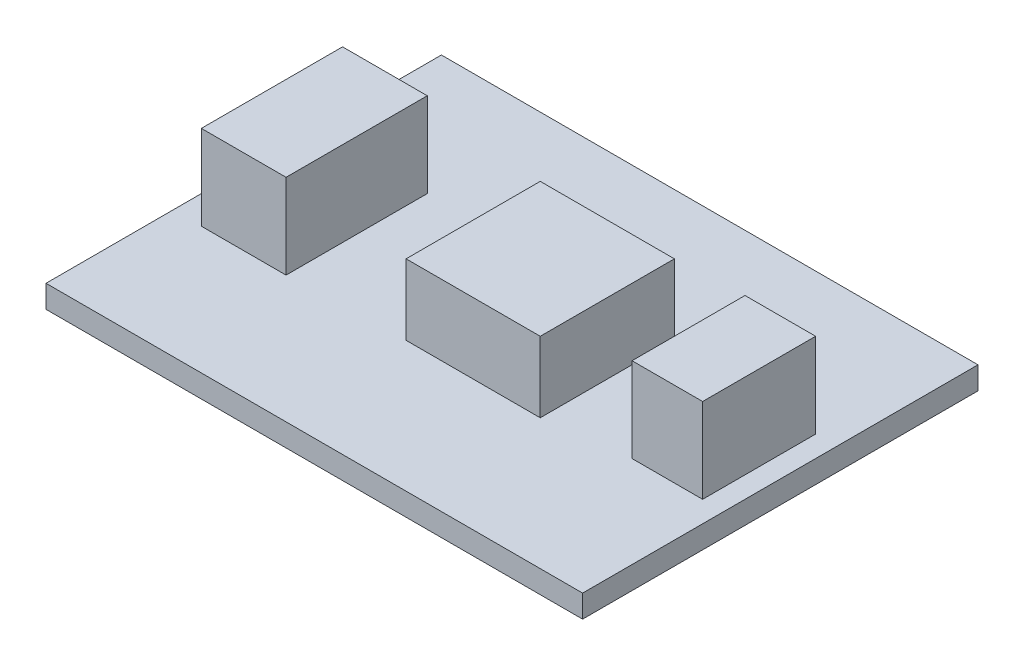
ISO-10303-21;
HEADER;
FILE_DESCRIPTION(('STEP AP214'),'2;1');
FILE_NAME('part.step','',(''),(''),'','','');
FILE_SCHEMA(('AUTOMOTIVE_DESIGN { 1 0 10303 214 1 1 1 1 }'));
ENDSEC;
DATA;
#1=APPLICATION_CONTEXT('core data for automotive mechanical design processes');
#2=APPLICATION_PROTOCOL_DEFINITION('international standard','automotive_design',2000,#1);
#3=PRODUCT_CONTEXT('',#1,'mechanical');
#4=PRODUCT('Part','Part','',(#3));
#5=PRODUCT_RELATED_PRODUCT_CATEGORY('part','',(#4));
#6=PRODUCT_DEFINITION_FORMATION('','',#4);
#7=PRODUCT_DEFINITION_CONTEXT('part definition',#1,'design');
#8=PRODUCT_DEFINITION('design','',#6,#7);
#9=PRODUCT_DEFINITION_SHAPE('','',#8);
#10=(LENGTH_UNIT() NAMED_UNIT(*) SI_UNIT(.MILLI.,.METRE.));
#11=(NAMED_UNIT(*) PLANE_ANGLE_UNIT() SI_UNIT($,.RADIAN.));
#12=(NAMED_UNIT(*) SI_UNIT($,.STERADIAN.) SOLID_ANGLE_UNIT());
#13=UNCERTAINTY_MEASURE_WITH_UNIT(LENGTH_MEASURE(1.E-05),#10,'distance_accuracy_value','');
#14=(GEOMETRIC_REPRESENTATION_CONTEXT(3) GLOBAL_UNCERTAINTY_ASSIGNED_CONTEXT((#13)) GLOBAL_UNIT_ASSIGNED_CONTEXT((#10,
#11,#12)) REPRESENTATION_CONTEXT('',''));
#15=CARTESIAN_POINT('',(0.,0.,0.));
#16=DIRECTION('',(0.,0.,1.));
#17=DIRECTION('',(1.,0.,0.));
#18=AXIS2_PLACEMENT_3D('',#15,#16,#17);
#19=CARTESIAN_POINT('',(0.,1.6,0.));
#20=DIRECTION('',(0.,-1.,0.));
#21=DIRECTION('',(0.,0.,-1.));
#22=AXIS2_PLACEMENT_3D('',#19,#20,#21);
#23=PLANE('',#22);
#24=DIRECTION('',(0.,0.,1.));
#25=VECTOR('',#24,1.);
#26=CARTESIAN_POINT('',(12.5,1.6,-4.));
#27=LINE('',#26,#25);
#28=CARTESIAN_POINT('',(12.5,1.6,-4.));
#29=VERTEX_POINT('',#28);
#30=CARTESIAN_POINT('',(12.5,1.6,4.));
#31=VERTEX_POINT('',#30);
#32=EDGE_CURVE('E182',#29,#31,#27,.T.);
#33=ORIENTED_EDGE('',*,*,#32,.F.);
#34=DIRECTION('',(-1.,0.,0.));
#35=VECTOR('',#34,1.);
#36=CARTESIAN_POINT('',(17.5,1.6,-4.));
#37=LINE('',#36,#35);
#38=CARTESIAN_POINT('',(17.5,1.6,-4.));
#39=VERTEX_POINT('',#38);
#40=EDGE_CURVE('E193',#39,#29,#37,.T.);
#41=ORIENTED_EDGE('',*,*,#40,.F.);
#42=DIRECTION('',(0.,0.,-1.));
#43=VECTOR('',#42,1.);
#44=CARTESIAN_POINT('',(17.5,1.6,4.));
#45=LINE('',#44,#43);
#46=CARTESIAN_POINT('',(17.5,1.6,4.));
#47=VERTEX_POINT('',#46);
#48=EDGE_CURVE('E201',#47,#39,#45,.T.);
#49=ORIENTED_EDGE('',*,*,#48,.F.);
#50=DIRECTION('',(1.,0.,0.));
#51=VECTOR('',#50,1.);
#52=CARTESIAN_POINT('',(12.5,1.6,4.));
#53=LINE('',#52,#51);
#54=EDGE_CURVE('E184',#31,#47,#53,.T.);
#55=ORIENTED_EDGE('',*,*,#54,.F.);
#56=EDGE_LOOP('',(#33,#41,#49,#55));
#57=FACE_BOUND('',#56,.T.);
#58=DIRECTION('',(0.,0.,-1.));
#59=VECTOR('',#58,1.);
#60=CARTESIAN_POINT('',(19.,1.6,14.));
#61=LINE('',#60,#59);
#62=CARTESIAN_POINT('',(19.,1.6,14.));
#63=VERTEX_POINT('',#62);
#64=CARTESIAN_POINT('',(19.,1.6,-14.));
#65=VERTEX_POINT('',#64);
#66=EDGE_CURVE('E251',#63,#65,#61,.T.);
#67=ORIENTED_EDGE('',*,*,#66,.T.);
#68=DIRECTION('',(-1.,0.,0.));
#69=VECTOR('',#68,1.);
#70=CARTESIAN_POINT('',(-19.,1.6,-14.));
#71=LINE('',#70,#69);
#72=CARTESIAN_POINT('',(-19.,1.6,-14.));
#73=VERTEX_POINT('',#72);
#74=EDGE_CURVE('E258',#65,#73,#71,.T.);
#75=ORIENTED_EDGE('',*,*,#74,.T.);
#76=DIRECTION('',(0.,0.,1.));
#77=VECTOR('',#76,1.);
#78=CARTESIAN_POINT('',(-19.,1.6,14.));
#79=LINE('',#78,#77);
#80=CARTESIAN_POINT('',(-19.,1.6,14.));
#81=VERTEX_POINT('',#80);
#82=EDGE_CURVE('E259',#73,#81,#79,.T.);
#83=ORIENTED_EDGE('',*,*,#82,.T.);
#84=DIRECTION('',(1.,0.,0.));
#85=VECTOR('',#84,1.);
#86=CARTESIAN_POINT('',(-19.,1.6,14.));
#87=LINE('',#86,#85);
#88=EDGE_CURVE('E261',#81,#63,#87,.T.);
#89=ORIENTED_EDGE('',*,*,#88,.T.);
#90=EDGE_LOOP('',(#67,#75,#83,#89));
#91=FACE_BOUND('',#90,.T.);
#92=DIRECTION('',(0.,0.,1.));
#93=VECTOR('',#92,1.);
#94=CARTESIAN_POINT('',(-17.,1.6,-5.));
#95=LINE('',#94,#93);
#96=CARTESIAN_POINT('',(-17.,1.6,-5.));
#97=VERTEX_POINT('',#96);
#98=CARTESIAN_POINT('',(-17.,1.6,5.));
#99=VERTEX_POINT('',#98);
#100=EDGE_CURVE('E218',#97,#99,#95,.T.);
#101=ORIENTED_EDGE('',*,*,#100,.F.);
#102=DIRECTION('',(-1.,0.,0.));
#103=VECTOR('',#102,1.);
#104=CARTESIAN_POINT('',(-11.,1.6,-5.));
#105=LINE('',#104,#103);
#106=CARTESIAN_POINT('',(-11.,1.6,-5.));
#107=VERTEX_POINT('',#106);
#108=EDGE_CURVE('E221',#107,#97,#105,.T.);
#109=ORIENTED_EDGE('',*,*,#108,.F.);
#110=DIRECTION('',(0.,0.,-1.));
#111=VECTOR('',#110,1.);
#112=CARTESIAN_POINT('',(-11.,1.6,5.));
#113=LINE('',#112,#111);
#114=CARTESIAN_POINT('',(-11.,1.6,5.));
#115=VERTEX_POINT('',#114);
#116=EDGE_CURVE('E237',#115,#107,#113,.T.);
#117=ORIENTED_EDGE('',*,*,#116,.F.);
#118=DIRECTION('',(1.,0.,0.));
#119=VECTOR('',#118,1.);
#120=CARTESIAN_POINT('',(-17.,1.6,5.));
#121=LINE('',#120,#119);
#122=EDGE_CURVE('E234',#99,#115,#121,.T.);
#123=ORIENTED_EDGE('',*,*,#122,.F.);
#124=EDGE_LOOP('',(#101,#109,#117,#123));
#125=FACE_BOUND('',#124,.T.);
#126=DIRECTION('',(0.,0.,1.));
#127=VECTOR('',#126,1.);
#128=CARTESIAN_POINT('',(-2.75,1.6,-4.75));
#129=LINE('',#128,#127);
#130=CARTESIAN_POINT('',(-2.75,1.6,-4.75));
#131=VERTEX_POINT('',#130);
#132=CARTESIAN_POINT('',(-2.75,1.6,4.75));
#133=VERTEX_POINT('',#132);
#134=EDGE_CURVE('E180',#131,#133,#129,.T.);
#135=ORIENTED_EDGE('',*,*,#134,.F.);
#136=DIRECTION('',(-1.,0.,0.));
#137=VECTOR('',#136,1.);
#138=CARTESIAN_POINT('',(6.75,1.6,-4.75));
#139=LINE('',#138,#137);
#140=CARTESIAN_POINT('',(6.75,1.6,-4.75));
#141=VERTEX_POINT('',#140);
#142=EDGE_CURVE('E177',#141,#131,#139,.T.);
#143=ORIENTED_EDGE('',*,*,#142,.F.);
#144=DIRECTION('',(0.,0.,-1.));
#145=VECTOR('',#144,1.);
#146=CARTESIAN_POINT('',(6.75,1.6,4.75));
#147=LINE('',#146,#145);
#148=CARTESIAN_POINT('',(6.75,1.6,4.75));
#149=VERTEX_POINT('',#148);
#150=EDGE_CURVE('E67',#149,#141,#147,.T.);
#151=ORIENTED_EDGE('',*,*,#150,.F.);
#152=DIRECTION('',(1.,0.,0.));
#153=VECTOR('',#152,1.);
#154=CARTESIAN_POINT('',(-2.75,1.6,4.75));
#155=LINE('',#154,#153);
#156=EDGE_CURVE('E65',#133,#149,#155,.T.);
#157=ORIENTED_EDGE('',*,*,#156,.F.);
#158=EDGE_LOOP('',(#135,#143,#151,#157));
#159=FACE_BOUND('',#158,.T.);
#160=ADVANCED_FACE('F50',(#57,#91,#125,#159),#23,.F.);
#161=CARTESIAN_POINT('',(19.,1.6,14.));
#162=DIRECTION('',(-1.,0.,0.));
#163=DIRECTION('',(0.,0.,1.));
#164=AXIS2_PLACEMENT_3D('',#161,#162,#163);
#165=PLANE('',#164);
#166=DIRECTION('',(0.,0.,-1.));
#167=VECTOR('',#166,1.);
#168=CARTESIAN_POINT('',(19.,0.,14.));
#169=LINE('',#168,#167);
#170=CARTESIAN_POINT('',(19.,0.,14.));
#171=VERTEX_POINT('',#170);
#172=CARTESIAN_POINT('',(19.,0.,-14.));
#173=VERTEX_POINT('',#172);
#174=EDGE_CURVE('E252',#171,#173,#169,.T.);
#175=ORIENTED_EDGE('',*,*,#174,.T.);
#176=DIRECTION('',(0.,-1.,0.));
#177=VECTOR('',#176,1.);
#178=CARTESIAN_POINT('',(19.,1.6,-14.));
#179=LINE('',#178,#177);
#180=EDGE_CURVE('E11',#65,#173,#179,.T.);
#181=ORIENTED_EDGE('',*,*,#180,.F.);
#182=ORIENTED_EDGE('',*,*,#66,.F.);
#183=DIRECTION('',(0.,-1.,0.));
#184=VECTOR('',#183,1.);
#185=CARTESIAN_POINT('',(19.,1.6,14.));
#186=LINE('',#185,#184);
#187=EDGE_CURVE('E263',#63,#171,#186,.T.);
#188=ORIENTED_EDGE('',*,*,#187,.T.);
#189=EDGE_LOOP('',(#175,#181,#182,#188));
#190=FACE_BOUND('',#189,.T.);
#191=ADVANCED_FACE('F47',(#190),#165,.F.);
#192=CARTESIAN_POINT('',(-19.,1.6,-14.));
#193=DIRECTION('',(0.,0.,1.));
#194=DIRECTION('',(1.,0.,0.));
#195=AXIS2_PLACEMENT_3D('',#192,#193,#194);
#196=PLANE('',#195);
#197=DIRECTION('',(-1.,0.,0.));
#198=VECTOR('',#197,1.);
#199=CARTESIAN_POINT('',(-19.,0.,-14.));
#200=LINE('',#199,#198);
#201=CARTESIAN_POINT('',(-19.,0.,-14.));
#202=VERTEX_POINT('',#201);
#203=EDGE_CURVE('E266',#173,#202,#200,.T.);
#204=ORIENTED_EDGE('',*,*,#203,.T.);
#205=DIRECTION('',(0.,-1.,0.));
#206=VECTOR('',#205,1.);
#207=CARTESIAN_POINT('',(-19.,1.6,-14.));
#208=LINE('',#207,#206);
#209=EDGE_CURVE('E54',#73,#202,#208,.T.);
#210=ORIENTED_EDGE('',*,*,#209,.F.);
#211=ORIENTED_EDGE('',*,*,#74,.F.);
#212=ORIENTED_EDGE('',*,*,#180,.T.);
#213=EDGE_LOOP('',(#204,#210,#211,#212));
#214=FACE_BOUND('',#213,.T.);
#215=ADVANCED_FACE('F298',(#214),#196,.F.);
#216=CARTESIAN_POINT('',(-19.,1.6,14.));
#217=DIRECTION('',(1.,0.,0.));
#218=DIRECTION('',(0.,0.,-1.));
#219=AXIS2_PLACEMENT_3D('',#216,#217,#218);
#220=PLANE('',#219);
#221=DIRECTION('',(0.,0.,1.));
#222=VECTOR('',#221,1.);
#223=CARTESIAN_POINT('',(-19.,0.,14.));
#224=LINE('',#223,#222);
#225=CARTESIAN_POINT('',(-19.,0.,14.));
#226=VERTEX_POINT('',#225);
#227=EDGE_CURVE('E268',#202,#226,#224,.T.);
#228=ORIENTED_EDGE('',*,*,#227,.T.);
#229=DIRECTION('',(0.,-1.,0.));
#230=VECTOR('',#229,1.);
#231=CARTESIAN_POINT('',(-19.,1.6,14.));
#232=LINE('',#231,#230);
#233=EDGE_CURVE('E272',#81,#226,#232,.T.);
#234=ORIENTED_EDGE('',*,*,#233,.F.);
#235=ORIENTED_EDGE('',*,*,#82,.F.);
#236=ORIENTED_EDGE('',*,*,#209,.T.);
#237=EDGE_LOOP('',(#228,#234,#235,#236));
#238=FACE_BOUND('',#237,.T.);
#239=ADVANCED_FACE('F278',(#238),#220,.F.);
#240=CARTESIAN_POINT('',(-19.,1.6,14.));
#241=DIRECTION('',(0.,0.,-1.));
#242=DIRECTION('',(-1.,0.,0.));
#243=AXIS2_PLACEMENT_3D('',#240,#241,#242);
#244=PLANE('',#243);
#245=DIRECTION('',(1.,0.,0.));
#246=VECTOR('',#245,1.);
#247=CARTESIAN_POINT('',(-19.,0.,14.));
#248=LINE('',#247,#246);
#249=EDGE_CURVE('E260',#226,#171,#248,.T.);
#250=ORIENTED_EDGE('',*,*,#249,.T.);
#251=ORIENTED_EDGE('',*,*,#187,.F.);
#252=ORIENTED_EDGE('',*,*,#88,.F.);
#253=ORIENTED_EDGE('',*,*,#233,.T.);
#254=EDGE_LOOP('',(#250,#251,#252,#253));
#255=FACE_BOUND('',#254,.T.);
#256=ADVANCED_FACE('F288',(#255),#244,.F.);
#257=CARTESIAN_POINT('',(0.,0.,0.));
#258=DIRECTION('',(0.,-1.,0.));
#259=DIRECTION('',(0.,0.,-1.));
#260=AXIS2_PLACEMENT_3D('',#257,#258,#259);
#261=PLANE('',#260);
#262=ORIENTED_EDGE('',*,*,#174,.F.);
#263=ORIENTED_EDGE('',*,*,#249,.F.);
#264=ORIENTED_EDGE('',*,*,#227,.F.);
#265=ORIENTED_EDGE('',*,*,#203,.F.);
#266=EDGE_LOOP('',(#262,#263,#264,#265));
#267=FACE_BOUND('',#266,.T.);
#268=ADVANCED_FACE('F286',(#267),#261,.T.);
#269=CARTESIAN_POINT('',(-17.,7.6,-5.));
#270=DIRECTION('',(1.,0.,0.));
#271=DIRECTION('',(0.,0.,-1.));
#272=AXIS2_PLACEMENT_3D('',#269,#270,#271);
#273=PLANE('',#272);
#274=ORIENTED_EDGE('',*,*,#100,.T.);
#275=DIRECTION('',(0.,-1.,0.));
#276=VECTOR('',#275,1.);
#277=CARTESIAN_POINT('',(-17.,7.6,5.));
#278=LINE('',#277,#276);
#279=CARTESIAN_POINT('',(-17.,7.6,5.));
#280=VERTEX_POINT('',#279);
#281=EDGE_CURVE('E248',#280,#99,#278,.T.);
#282=ORIENTED_EDGE('',*,*,#281,.F.);
#283=DIRECTION('',(0.,0.,1.));
#284=VECTOR('',#283,1.);
#285=CARTESIAN_POINT('',(-17.,7.6,-5.));
#286=LINE('',#285,#284);
#287=CARTESIAN_POINT('',(-17.,7.6,-5.));
#288=VERTEX_POINT('',#287);
#289=EDGE_CURVE('E219',#288,#280,#286,.T.);
#290=ORIENTED_EDGE('',*,*,#289,.F.);
#291=DIRECTION('',(0.,-1.,0.));
#292=VECTOR('',#291,1.);
#293=CARTESIAN_POINT('',(-17.,7.6,-5.));
#294=LINE('',#293,#292);
#295=EDGE_CURVE('E229',#288,#97,#294,.T.);
#296=ORIENTED_EDGE('',*,*,#295,.T.);
#297=EDGE_LOOP('',(#274,#282,#290,#296));
#298=FACE_BOUND('',#297,.T.);
#299=ADVANCED_FACE('F315',(#298),#273,.F.);
#300=CARTESIAN_POINT('',(-17.,7.6,5.));
#301=DIRECTION('',(0.,0.,-1.));
#302=DIRECTION('',(-1.,0.,0.));
#303=AXIS2_PLACEMENT_3D('',#300,#301,#302);
#304=PLANE('',#303);
#305=ORIENTED_EDGE('',*,*,#122,.T.);
#306=DIRECTION('',(0.,-1.,0.));
#307=VECTOR('',#306,1.);
#308=CARTESIAN_POINT('',(-11.,7.6,5.));
#309=LINE('',#308,#307);
#310=CARTESIAN_POINT('',(-11.,7.6,5.));
#311=VERTEX_POINT('',#310);
#312=EDGE_CURVE('E246',#311,#115,#309,.T.);
#313=ORIENTED_EDGE('',*,*,#312,.F.);
#314=DIRECTION('',(1.,0.,0.));
#315=VECTOR('',#314,1.);
#316=CARTESIAN_POINT('',(-17.,7.6,5.));
#317=LINE('',#316,#315);
#318=EDGE_CURVE('E224',#280,#311,#317,.T.);
#319=ORIENTED_EDGE('',*,*,#318,.F.);
#320=ORIENTED_EDGE('',*,*,#281,.T.);
#321=EDGE_LOOP('',(#305,#313,#319,#320));
#322=FACE_BOUND('',#321,.T.);
#323=ADVANCED_FACE('F333',(#322),#304,.F.);
#324=CARTESIAN_POINT('',(-11.,7.6,5.));
#325=DIRECTION('',(-1.,0.,0.));
#326=DIRECTION('',(0.,0.,1.));
#327=AXIS2_PLACEMENT_3D('',#324,#325,#326);
#328=PLANE('',#327);
#329=ORIENTED_EDGE('',*,*,#116,.T.);
#330=DIRECTION('',(0.,-1.,0.));
#331=VECTOR('',#330,1.);
#332=CARTESIAN_POINT('',(-11.,7.6,-5.));
#333=LINE('',#332,#331);
#334=CARTESIAN_POINT('',(-11.,7.6,-5.));
#335=VERTEX_POINT('',#334);
#336=EDGE_CURVE('E241',#335,#107,#333,.T.);
#337=ORIENTED_EDGE('',*,*,#336,.F.);
#338=DIRECTION('',(0.,0.,-1.));
#339=VECTOR('',#338,1.);
#340=CARTESIAN_POINT('',(-11.,7.6,5.));
#341=LINE('',#340,#339);
#342=EDGE_CURVE('E228',#311,#335,#341,.T.);
#343=ORIENTED_EDGE('',*,*,#342,.F.);
#344=ORIENTED_EDGE('',*,*,#312,.T.);
#345=EDGE_LOOP('',(#329,#337,#343,#344));
#346=FACE_BOUND('',#345,.T.);
#347=ADVANCED_FACE('F347',(#346),#328,.F.);
#348=CARTESIAN_POINT('',(-11.,7.6,-5.));
#349=DIRECTION('',(0.,0.,1.));
#350=DIRECTION('',(1.,0.,0.));
#351=AXIS2_PLACEMENT_3D('',#348,#349,#350);
#352=PLANE('',#351);
#353=ORIENTED_EDGE('',*,*,#108,.T.);
#354=ORIENTED_EDGE('',*,*,#295,.F.);
#355=DIRECTION('',(-1.,0.,0.));
#356=VECTOR('',#355,1.);
#357=CARTESIAN_POINT('',(-11.,7.6,-5.));
#358=LINE('',#357,#356);
#359=EDGE_CURVE('E226',#335,#288,#358,.T.);
#360=ORIENTED_EDGE('',*,*,#359,.F.);
#361=ORIENTED_EDGE('',*,*,#336,.T.);
#362=EDGE_LOOP('',(#353,#354,#360,#361));
#363=FACE_BOUND('',#362,.T.);
#364=ADVANCED_FACE('F357',(#363),#352,.F.);
#365=CARTESIAN_POINT('',(0.,7.6,0.));
#366=DIRECTION('',(0.,1.,0.));
#367=DIRECTION('',(0.,0.,1.));
#368=AXIS2_PLACEMENT_3D('',#365,#366,#367);
#369=PLANE('',#368);
#370=ORIENTED_EDGE('',*,*,#289,.T.);
#371=ORIENTED_EDGE('',*,*,#318,.T.);
#372=ORIENTED_EDGE('',*,*,#342,.T.);
#373=ORIENTED_EDGE('',*,*,#359,.T.);
#374=EDGE_LOOP('',(#370,#371,#372,#373));
#375=FACE_BOUND('',#374,.T.);
#376=ADVANCED_FACE('F369',(#375),#369,.T.);
#377=CARTESIAN_POINT('',(12.5,7.6,-4.));
#378=DIRECTION('',(1.,0.,0.));
#379=DIRECTION('',(0.,0.,-1.));
#380=AXIS2_PLACEMENT_3D('',#377,#378,#379);
#381=PLANE('',#380);
#382=ORIENTED_EDGE('',*,*,#32,.T.);
#383=DIRECTION('',(0.,-1.,0.));
#384=VECTOR('',#383,1.);
#385=CARTESIAN_POINT('',(12.5,7.6,4.));
#386=LINE('',#385,#384);
#387=CARTESIAN_POINT('',(12.5,7.6,4.));
#388=VERTEX_POINT('',#387);
#389=EDGE_CURVE('E216',#388,#31,#386,.T.);
#390=ORIENTED_EDGE('',*,*,#389,.F.);
#391=DIRECTION('',(0.,0.,1.));
#392=VECTOR('',#391,1.);
#393=CARTESIAN_POINT('',(12.5,7.6,-4.));
#394=LINE('',#393,#392);
#395=CARTESIAN_POINT('',(12.5,7.6,-4.));
#396=VERTEX_POINT('',#395);
#397=EDGE_CURVE('E189',#396,#388,#394,.T.);
#398=ORIENTED_EDGE('',*,*,#397,.F.);
#399=DIRECTION('',(0.,-1.,0.));
#400=VECTOR('',#399,1.);
#401=CARTESIAN_POINT('',(12.5,7.6,-4.));
#402=LINE('',#401,#400);
#403=EDGE_CURVE('E200',#396,#29,#402,.T.);
#404=ORIENTED_EDGE('',*,*,#403,.T.);
#405=EDGE_LOOP('',(#382,#390,#398,#404));
#406=FACE_BOUND('',#405,.T.);
#407=ADVANCED_FACE('F381',(#406),#381,.F.);
#408=CARTESIAN_POINT('',(12.5,7.6,4.));
#409=DIRECTION('',(0.,0.,-1.));
#410=DIRECTION('',(-1.,0.,0.));
#411=AXIS2_PLACEMENT_3D('',#408,#409,#410);
#412=PLANE('',#411);
#413=ORIENTED_EDGE('',*,*,#54,.T.);
#414=DIRECTION('',(0.,-1.,0.));
#415=VECTOR('',#414,1.);
#416=CARTESIAN_POINT('',(17.5,7.6,4.));
#417=LINE('',#416,#415);
#418=CARTESIAN_POINT('',(17.5,7.6,4.));
#419=VERTEX_POINT('',#418);
#420=EDGE_CURVE('E213',#419,#47,#417,.T.);
#421=ORIENTED_EDGE('',*,*,#420,.F.);
#422=DIRECTION('',(1.,0.,0.));
#423=VECTOR('',#422,1.);
#424=CARTESIAN_POINT('',(12.5,7.6,4.));
#425=LINE('',#424,#423);
#426=EDGE_CURVE('E194',#388,#419,#425,.T.);
#427=ORIENTED_EDGE('',*,*,#426,.F.);
#428=ORIENTED_EDGE('',*,*,#389,.T.);
#429=EDGE_LOOP('',(#413,#421,#427,#428));
#430=FACE_BOUND('',#429,.T.);
#431=ADVANCED_FACE('F391',(#430),#412,.F.);
#432=CARTESIAN_POINT('',(17.5,7.6,4.));
#433=DIRECTION('',(-1.,0.,0.));
#434=DIRECTION('',(0.,0.,1.));
#435=AXIS2_PLACEMENT_3D('',#432,#433,#434);
#436=PLANE('',#435);
#437=ORIENTED_EDGE('',*,*,#48,.T.);
#438=DIRECTION('',(0.,-1.,0.));
#439=VECTOR('',#438,1.);
#440=CARTESIAN_POINT('',(17.5,7.6,-4.));
#441=LINE('',#440,#439);
#442=CARTESIAN_POINT('',(17.5,7.6,-4.));
#443=VERTEX_POINT('',#442);
#444=EDGE_CURVE('E209',#443,#39,#441,.T.);
#445=ORIENTED_EDGE('',*,*,#444,.F.);
#446=DIRECTION('',(0.,0.,-1.));
#447=VECTOR('',#446,1.);
#448=CARTESIAN_POINT('',(17.5,7.6,4.));
#449=LINE('',#448,#447);
#450=EDGE_CURVE('E198',#419,#443,#449,.T.);
#451=ORIENTED_EDGE('',*,*,#450,.F.);
#452=ORIENTED_EDGE('',*,*,#420,.T.);
#453=EDGE_LOOP('',(#437,#445,#451,#452));
#454=FACE_BOUND('',#453,.T.);
#455=ADVANCED_FACE('F403',(#454),#436,.F.);
#456=CARTESIAN_POINT('',(17.5,7.6,-4.));
#457=DIRECTION('',(0.,0.,1.));
#458=DIRECTION('',(1.,0.,0.));
#459=AXIS2_PLACEMENT_3D('',#456,#457,#458);
#460=PLANE('',#459);
#461=ORIENTED_EDGE('',*,*,#40,.T.);
#462=ORIENTED_EDGE('',*,*,#403,.F.);
#463=DIRECTION('',(-1.,0.,0.));
#464=VECTOR('',#463,1.);
#465=CARTESIAN_POINT('',(17.5,7.6,-4.));
#466=LINE('',#465,#464);
#467=EDGE_CURVE('E196',#443,#396,#466,.T.);
#468=ORIENTED_EDGE('',*,*,#467,.F.);
#469=ORIENTED_EDGE('',*,*,#444,.T.);
#470=EDGE_LOOP('',(#461,#462,#468,#469));
#471=FACE_BOUND('',#470,.T.);
#472=ADVANCED_FACE('F417',(#471),#460,.F.);
#473=CARTESIAN_POINT('',(0.,7.6,0.));
#474=DIRECTION('',(0.,1.,0.));
#475=DIRECTION('',(0.,0.,1.));
#476=AXIS2_PLACEMENT_3D('',#473,#474,#475);
#477=PLANE('',#476);
#478=ORIENTED_EDGE('',*,*,#397,.T.);
#479=ORIENTED_EDGE('',*,*,#426,.T.);
#480=ORIENTED_EDGE('',*,*,#450,.T.);
#481=ORIENTED_EDGE('',*,*,#467,.T.);
#482=EDGE_LOOP('',(#478,#479,#480,#481));
#483=FACE_BOUND('',#482,.T.);
#484=ADVANCED_FACE('F428',(#483),#477,.T.);
#485=CARTESIAN_POINT('',(-2.75,6.6,-4.75));
#486=DIRECTION('',(1.,0.,0.));
#487=DIRECTION('',(0.,0.,-1.));
#488=AXIS2_PLACEMENT_3D('',#485,#486,#487);
#489=PLANE('',#488);
#490=ORIENTED_EDGE('',*,*,#134,.T.);
#491=DIRECTION('',(0.,-1.,0.));
#492=VECTOR('',#491,1.);
#493=CARTESIAN_POINT('',(-2.75,6.6,4.75));
#494=LINE('',#493,#492);
#495=CARTESIAN_POINT('',(-2.75,6.6,4.75));
#496=VERTEX_POINT('',#495);
#497=EDGE_CURVE('E161',#496,#133,#494,.T.);
#498=ORIENTED_EDGE('',*,*,#497,.F.);
#499=DIRECTION('',(0.,0.,1.));
#500=VECTOR('',#499,1.);
#501=CARTESIAN_POINT('',(-2.75,6.6,-4.75));
#502=LINE('',#501,#500);
#503=CARTESIAN_POINT('',(-2.75,6.6,-4.75));
#504=VERTEX_POINT('',#503);
#505=EDGE_CURVE('E169',#504,#496,#502,.T.);
#506=ORIENTED_EDGE('',*,*,#505,.F.);
#507=DIRECTION('',(0.,-1.,0.));
#508=VECTOR('',#507,1.);
#509=CARTESIAN_POINT('',(-2.75,6.6,-4.75));
#510=LINE('',#509,#508);
#511=EDGE_CURVE('E541',#504,#131,#510,.T.);
#512=ORIENTED_EDGE('',*,*,#511,.T.);
#513=EDGE_LOOP('',(#490,#498,#506,#512));
#514=FACE_BOUND('',#513,.T.);
#515=ADVANCED_FACE('F178',(#514),#489,.F.);
#516=CARTESIAN_POINT('',(-2.75,6.6,4.75));
#517=DIRECTION('',(0.,0.,-1.));
#518=DIRECTION('',(-1.,0.,0.));
#519=AXIS2_PLACEMENT_3D('',#516,#517,#518);
#520=PLANE('',#519);
#521=ORIENTED_EDGE('',*,*,#156,.T.);
#522=DIRECTION('',(0.,-1.,0.));
#523=VECTOR('',#522,1.);
#524=CARTESIAN_POINT('',(6.75,6.6,4.75));
#525=LINE('',#524,#523);
#526=CARTESIAN_POINT('',(6.75,6.6,4.75));
#527=VERTEX_POINT('',#526);
#528=EDGE_CURVE('E163',#527,#149,#525,.T.);
#529=ORIENTED_EDGE('',*,*,#528,.F.);
#530=DIRECTION('',(1.,0.,0.));
#531=VECTOR('',#530,1.);
#532=CARTESIAN_POINT('',(-2.75,6.6,4.75));
#533=LINE('',#532,#531);
#534=EDGE_CURVE('E160',#496,#527,#533,.T.);
#535=ORIENTED_EDGE('',*,*,#534,.F.);
#536=ORIENTED_EDGE('',*,*,#497,.T.);
#537=EDGE_LOOP('',(#521,#529,#535,#536));
#538=FACE_BOUND('',#537,.T.);
#539=ADVANCED_FACE('F157',(#538),#520,.F.);
#540=CARTESIAN_POINT('',(6.75,6.6,4.75));
#541=DIRECTION('',(-1.,0.,0.));
#542=DIRECTION('',(0.,0.,1.));
#543=AXIS2_PLACEMENT_3D('',#540,#541,#542);
#544=PLANE('',#543);
#545=ORIENTED_EDGE('',*,*,#150,.T.);
#546=DIRECTION('',(0.,-1.,0.));
#547=VECTOR('',#546,1.);
#548=CARTESIAN_POINT('',(6.75,6.6,-4.75));
#549=LINE('',#548,#547);
#550=CARTESIAN_POINT('',(6.75,6.6,-4.75));
#551=VERTEX_POINT('',#550);
#552=EDGE_CURVE('E188',#551,#141,#549,.T.);
#553=ORIENTED_EDGE('',*,*,#552,.F.);
#554=DIRECTION('',(0.,0.,-1.));
#555=VECTOR('',#554,1.);
#556=CARTESIAN_POINT('',(6.75,6.6,4.75));
#557=LINE('',#556,#555);
#558=EDGE_CURVE('E170',#527,#551,#557,.T.);
#559=ORIENTED_EDGE('',*,*,#558,.F.);
#560=ORIENTED_EDGE('',*,*,#528,.T.);
#561=EDGE_LOOP('',(#545,#553,#559,#560));
#562=FACE_BOUND('',#561,.T.);
#563=ADVANCED_FACE('F459',(#562),#544,.F.);
#564=CARTESIAN_POINT('',(6.75,6.6,-4.75));
#565=DIRECTION('',(0.,0.,1.));
#566=DIRECTION('',(1.,0.,0.));
#567=AXIS2_PLACEMENT_3D('',#564,#565,#566);
#568=PLANE('',#567);
#569=ORIENTED_EDGE('',*,*,#142,.T.);
#570=ORIENTED_EDGE('',*,*,#511,.F.);
#571=DIRECTION('',(-1.,0.,0.));
#572=VECTOR('',#571,1.);
#573=CARTESIAN_POINT('',(6.75,6.6,-4.75));
#574=LINE('',#573,#572);
#575=EDGE_CURVE('E171',#551,#504,#574,.T.);
#576=ORIENTED_EDGE('',*,*,#575,.F.);
#577=ORIENTED_EDGE('',*,*,#552,.T.);
#578=EDGE_LOOP('',(#569,#570,#576,#577));
#579=FACE_BOUND('',#578,.T.);
#580=ADVANCED_FACE('F469',(#579),#568,.F.);
#581=CARTESIAN_POINT('',(0.,6.6,0.));
#582=DIRECTION('',(0.,1.,0.));
#583=DIRECTION('',(0.,0.,1.));
#584=AXIS2_PLACEMENT_3D('',#581,#582,#583);
#585=PLANE('',#584);
#586=ORIENTED_EDGE('',*,*,#505,.T.);
#587=ORIENTED_EDGE('',*,*,#534,.T.);
#588=ORIENTED_EDGE('',*,*,#558,.T.);
#589=ORIENTED_EDGE('',*,*,#575,.T.);
#590=EDGE_LOOP('',(#586,#587,#588,#589));
#591=FACE_BOUND('',#590,.T.);
#592=ADVANCED_FACE('F173',(#591),#585,.T.);
#593=CLOSED_SHELL('',(#160,#191,#215,#239,#256,#268,#299,#323,#347,#364,#376,#407,#431,#455,
#472,#484,#515,#539,#563,#580,#592));
#594=MANIFOLD_SOLID_BREP('B2',#593);
#595=ADVANCED_BREP_SHAPE_REPRESENTATION('',(#18,#594),#14);
#596=SHAPE_DEFINITION_REPRESENTATION(#9,#595);
ENDSEC;
END-ISO-10303-21;
